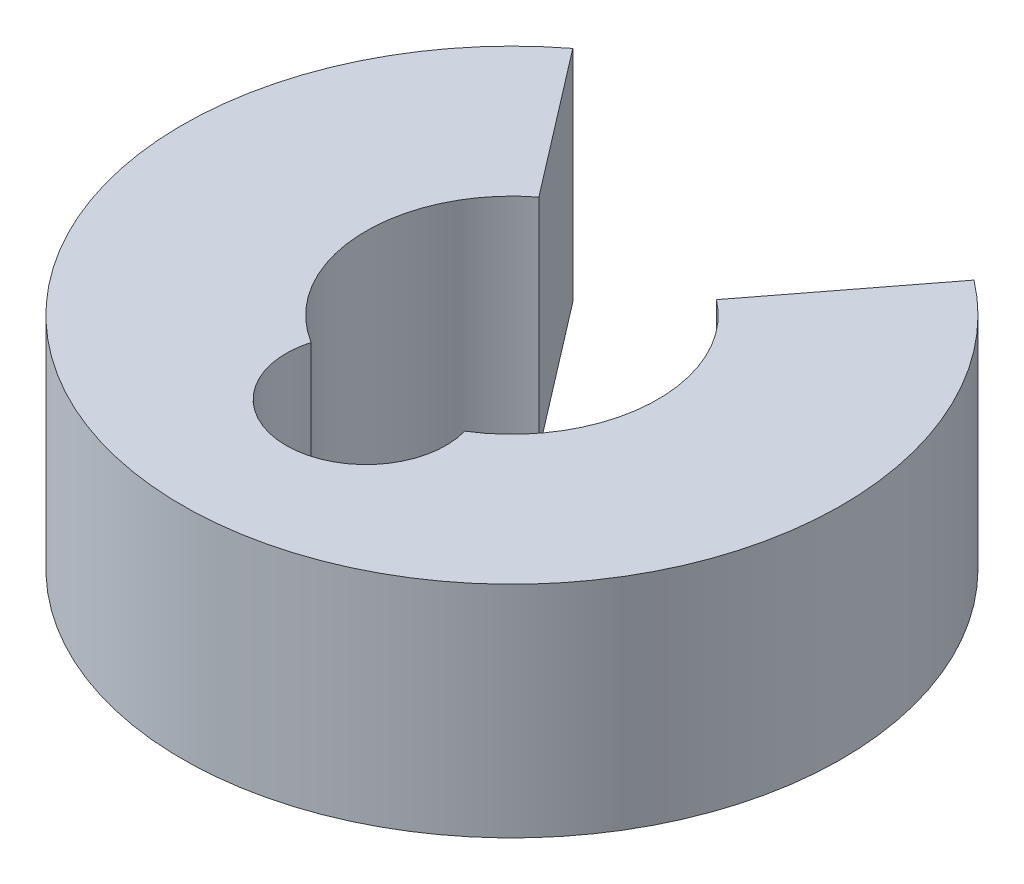
ISO-10303-21;
HEADER;
FILE_DESCRIPTION(('STEP AP214'),'2;1');
FILE_NAME('part.step','',(''),(''),'','','');
FILE_SCHEMA(('AUTOMOTIVE_DESIGN { 1 0 10303 214 1 1 1 1 }'));
ENDSEC;
DATA;
#1=APPLICATION_CONTEXT('core data for automotive mechanical design processes');
#2=APPLICATION_PROTOCOL_DEFINITION('international standard','automotive_design',2000,#1);
#3=PRODUCT_CONTEXT('',#1,'mechanical');
#4=PRODUCT('Part','Part','',(#3));
#5=PRODUCT_RELATED_PRODUCT_CATEGORY('part','',(#4));
#6=PRODUCT_DEFINITION_FORMATION('','',#4);
#7=PRODUCT_DEFINITION_CONTEXT('part definition',#1,'design');
#8=PRODUCT_DEFINITION('design','',#6,#7);
#9=PRODUCT_DEFINITION_SHAPE('','',#8);
#10=(LENGTH_UNIT() NAMED_UNIT(*) SI_UNIT(.MILLI.,.METRE.));
#11=(NAMED_UNIT(*) PLANE_ANGLE_UNIT() SI_UNIT($,.RADIAN.));
#12=(NAMED_UNIT(*) SI_UNIT($,.STERADIAN.) SOLID_ANGLE_UNIT());
#13=UNCERTAINTY_MEASURE_WITH_UNIT(LENGTH_MEASURE(1.E-05),#10,'distance_accuracy_value','');
#14=(GEOMETRIC_REPRESENTATION_CONTEXT(3) GLOBAL_UNCERTAINTY_ASSIGNED_CONTEXT((#13)) GLOBAL_UNIT_ASSIGNED_CONTEXT((#10,
#11,#12)) REPRESENTATION_CONTEXT('',''));
#15=CARTESIAN_POINT('',(0.,0.,0.));
#16=DIRECTION('',(0.,0.,1.));
#17=DIRECTION('',(1.,0.,0.));
#18=AXIS2_PLACEMENT_3D('',#15,#16,#17);
#19=CARTESIAN_POINT('',(0.,1.5875,2.1082));
#20=DIRECTION('',(0.,-1.,0.));
#21=DIRECTION('',(0.,0.,-1.));
#22=AXIS2_PLACEMENT_3D('',#19,#20,#21);
#23=CYLINDRICAL_SURFACE('',#22,1.1543);
#24=DIRECTION('',(0.,1.,0.));
#25=VECTOR('',#24,1.);
#26=CARTESIAN_POINT('',(-1.11020204436313,0.,1.7921938122569));
#27=LINE('',#26,#25);
#28=CARTESIAN_POINT('',(-1.11020204436313,-1.5875,1.7921938122569));
#29=VERTEX_POINT('',#28);
#30=CARTESIAN_POINT('',(-1.11020204436313,1.5875,1.7921938122569));
#31=VERTEX_POINT('',#30);
#32=EDGE_CURVE('E126',#29,#31,#27,.T.);
#33=ORIENTED_EDGE('',*,*,#32,.T.);
#34=CARTESIAN_POINT('',(0.,1.5875,2.1082));
#35=DIRECTION('',(0.,-1.,0.));
#36=DIRECTION('',(0.,0.,-1.));
#37=AXIS2_PLACEMENT_3D('',#34,#35,#36);
#38=CIRCLE('',#37,1.1543);
#39=CARTESIAN_POINT('',(1.11020204436313,1.5875,1.7921938122569));
#40=VERTEX_POINT('',#39);
#41=EDGE_CURVE('E119',#40,#31,#38,.T.);
#42=ORIENTED_EDGE('',*,*,#41,.F.);
#43=DIRECTION('',(0.,-1.,0.));
#44=VECTOR('',#43,1.);
#45=CARTESIAN_POINT('',(1.11020204436313,0.,1.7921938122569));
#46=LINE('',#45,#44);
#47=CARTESIAN_POINT('',(1.11020204436313,-1.5875,1.7921938122569));
#48=VERTEX_POINT('',#47);
#49=EDGE_CURVE('E27',#40,#48,#46,.T.);
#50=ORIENTED_EDGE('',*,*,#49,.T.);
#51=CARTESIAN_POINT('',(0.,-1.5875,2.1082));
#52=DIRECTION('',(0.,-1.,0.));
#53=DIRECTION('',(0.,0.,-1.));
#54=AXIS2_PLACEMENT_3D('',#51,#52,#53);
#55=CIRCLE('',#54,1.1543);
#56=EDGE_CURVE('E124',#48,#29,#55,.T.);
#57=ORIENTED_EDGE('',*,*,#56,.T.);
#58=EDGE_LOOP('',(#33,#42,#50,#57));
#59=FACE_BOUND('',#58,.T.);
#60=ADVANCED_FACE('F16',(#59),#23,.F.);
#61=CARTESIAN_POINT('',(0.,1.5875,0.));
#62=DIRECTION('',(-0.793353340291235,0.,0.608761429008721));
#63=DIRECTION('',(0.,1.,0.));
#64=AXIS2_PLACEMENT_3D('',#61,#62,#63);
#65=PLANE('',#64);
#66=DIRECTION('',(0.,-1.,0.));
#67=VECTOR('',#66,1.);
#68=CARTESIAN_POINT('',(-1.28339084463619,1.5875,-1.67254751200198));
#69=LINE('',#68,#67);
#70=CARTESIAN_POINT('',(-1.28339084463619,1.5875,-1.67254751200198));
#71=VERTEX_POINT('',#70);
#72=CARTESIAN_POINT('',(-1.28339084463619,-1.5875,-1.67254751200198));
#73=VERTEX_POINT('',#72);
#74=EDGE_CURVE('E138',#71,#73,#69,.T.);
#75=ORIENTED_EDGE('',*,*,#74,.T.);
#76=DIRECTION('',(-0.608761429008721,0.,-0.793353340291235));
#77=VECTOR('',#76,1.);
#78=CARTESIAN_POINT('',(0.,-1.5875,0.));
#79=LINE('',#78,#77);
#80=CARTESIAN_POINT('',(-2.89922630565404,-1.5875,-3.778345283137));
#81=VERTEX_POINT('',#80);
#82=EDGE_CURVE('E89',#73,#81,#79,.T.);
#83=ORIENTED_EDGE('',*,*,#82,.T.);
#84=DIRECTION('',(0.,-1.,0.));
#85=VECTOR('',#84,1.);
#86=CARTESIAN_POINT('',(-2.89922630565404,1.5875,-3.778345283137));
#87=LINE('',#86,#85);
#88=CARTESIAN_POINT('',(-2.89922630565404,1.5875,-3.778345283137));
#89=VERTEX_POINT('',#88);
#90=EDGE_CURVE('E41',#89,#81,#87,.T.);
#91=ORIENTED_EDGE('',*,*,#90,.F.);
#92=DIRECTION('',(-0.608761429008721,0.,-0.793353340291235));
#93=VECTOR('',#92,1.);
#94=CARTESIAN_POINT('',(0.,1.5875,0.));
#95=LINE('',#94,#93);
#96=EDGE_CURVE('E19',#71,#89,#95,.T.);
#97=ORIENTED_EDGE('',*,*,#96,.F.);
#98=EDGE_LOOP('',(#75,#83,#91,#97));
#99=FACE_BOUND('',#98,.T.);
#100=ADVANCED_FACE('F200',(#99),#65,.F.);
#101=CARTESIAN_POINT('',(0.,1.5875,0.));
#102=DIRECTION('',(-0.793353340291234,0.,-0.608761429008723));
#103=DIRECTION('',(-0.608761429008723,0.,0.793353340291234));
#104=AXIS2_PLACEMENT_3D('',#101,#102,#103);
#105=PLANE('',#104);
#106=DIRECTION('',(0.608761429008722,0.,-0.793353340291234));
#107=VECTOR('',#106,1.);
#108=CARTESIAN_POINT('',(0.,1.5875,0.));
#109=LINE('',#108,#107);
#110=CARTESIAN_POINT('',(1.28339084463619,1.5875,-1.67254751200198));
#111=VERTEX_POINT('',#110);
#112=CARTESIAN_POINT('',(2.89922630565404,1.5875,-3.778345283137));
#113=VERTEX_POINT('',#112);
#114=EDGE_CURVE('E122',#111,#113,#109,.T.);
#115=ORIENTED_EDGE('',*,*,#114,.T.);
#116=DIRECTION('',(0.,-1.,0.));
#117=VECTOR('',#116,1.);
#118=CARTESIAN_POINT('',(2.89922630565404,1.5875,-3.778345283137));
#119=LINE('',#118,#117);
#120=CARTESIAN_POINT('',(2.89922630565404,-1.5875,-3.778345283137));
#121=VERTEX_POINT('',#120);
#122=EDGE_CURVE('E68',#113,#121,#119,.T.);
#123=ORIENTED_EDGE('',*,*,#122,.T.);
#124=DIRECTION('',(0.608761429008722,0.,-0.793353340291234));
#125=VECTOR('',#124,1.);
#126=CARTESIAN_POINT('',(0.,-1.5875,0.));
#127=LINE('',#126,#125);
#128=CARTESIAN_POINT('',(1.28339084463619,-1.5875,-1.67254751200198));
#129=VERTEX_POINT('',#128);
#130=EDGE_CURVE('E150',#129,#121,#127,.T.);
#131=ORIENTED_EDGE('',*,*,#130,.F.);
#132=DIRECTION('',(0.,-1.,0.));
#133=VECTOR('',#132,1.);
#134=CARTESIAN_POINT('',(1.28339084463619,1.5875,-1.67254751200198));
#135=LINE('',#134,#133);
#136=EDGE_CURVE('E10',#111,#129,#135,.T.);
#137=ORIENTED_EDGE('',*,*,#136,.F.);
#138=EDGE_LOOP('',(#115,#123,#131,#137));
#139=FACE_BOUND('',#138,.T.);
#140=ADVANCED_FACE('F194',(#139),#105,.T.);
#141=CARTESIAN_POINT('',(0.,1.5875,0.));
#142=DIRECTION('',(0.,-1.,0.));
#143=DIRECTION('',(0.,0.,-1.));
#144=AXIS2_PLACEMENT_3D('',#141,#142,#143);
#145=CYLINDRICAL_SURFACE('',#144,2.1082);
#146=ORIENTED_EDGE('',*,*,#49,.F.);
#147=CARTESIAN_POINT('',(0.,1.5875,0.));
#148=DIRECTION('',(0.,1.,0.));
#149=DIRECTION('',(0.,0.,1.));
#150=AXIS2_PLACEMENT_3D('',#147,#148,#149);
#151=CIRCLE('',#150,2.1082);
#152=EDGE_CURVE('E107',#40,#111,#151,.T.);
#153=ORIENTED_EDGE('',*,*,#152,.T.);
#154=ORIENTED_EDGE('',*,*,#136,.T.);
#155=CARTESIAN_POINT('',(0.,-1.5875,0.));
#156=DIRECTION('',(0.,1.,0.));
#157=DIRECTION('',(0.,0.,1.));
#158=AXIS2_PLACEMENT_3D('',#155,#156,#157);
#159=CIRCLE('',#158,2.1082);
#160=EDGE_CURVE('E112',#48,#129,#159,.T.);
#161=ORIENTED_EDGE('',*,*,#160,.F.);
#162=EDGE_LOOP('',(#146,#153,#154,#161));
#163=FACE_BOUND('',#162,.T.);
#164=ADVANCED_FACE('F110',(#163),#145,.F.);
#165=CARTESIAN_POINT('',(0.,1.5875,0.));
#166=DIRECTION('',(0.,-1.,0.));
#167=DIRECTION('',(0.,0.,-1.));
#168=AXIS2_PLACEMENT_3D('',#165,#166,#167);
#169=CYLINDRICAL_SURFACE('',#168,4.7625);
#170=CARTESIAN_POINT('',(0.,1.5875,0.));
#171=DIRECTION('',(0.,1.,0.));
#172=DIRECTION('',(0.,0.,1.));
#173=AXIS2_PLACEMENT_3D('',#170,#171,#172);
#174=CIRCLE('',#173,4.7625);
#175=EDGE_CURVE('E136',#89,#113,#174,.T.);
#176=ORIENTED_EDGE('',*,*,#175,.F.);
#177=ORIENTED_EDGE('',*,*,#90,.T.);
#178=CARTESIAN_POINT('',(0.,-1.5875,0.));
#179=DIRECTION('',(0.,1.,0.));
#180=DIRECTION('',(0.,0.,1.));
#181=AXIS2_PLACEMENT_3D('',#178,#179,#180);
#182=CIRCLE('',#181,4.7625);
#183=EDGE_CURVE('E145',#81,#121,#182,.T.);
#184=ORIENTED_EDGE('',*,*,#183,.T.);
#185=ORIENTED_EDGE('',*,*,#122,.F.);
#186=EDGE_LOOP('',(#176,#177,#184,#185));
#187=FACE_BOUND('',#186,.T.);
#188=ADVANCED_FACE('F221',(#187),#169,.T.);
#189=CARTESIAN_POINT('',(0.,-1.5875,0.));
#190=DIRECTION('',(0.,1.,0.));
#191=DIRECTION('',(1.,0.,0.));
#192=AXIS2_PLACEMENT_3D('',#189,#190,#191);
#193=PLANE('',#192);
#194=CARTESIAN_POINT('',(0.,-1.5875,0.));
#195=DIRECTION('',(0.,1.,0.));
#196=DIRECTION('',(0.,0.,1.));
#197=AXIS2_PLACEMENT_3D('',#194,#195,#196);
#198=CIRCLE('',#197,2.1082);
#199=EDGE_CURVE('E165',#73,#29,#198,.T.);
#200=ORIENTED_EDGE('',*,*,#199,.T.);
#201=ORIENTED_EDGE('',*,*,#56,.F.);
#202=ORIENTED_EDGE('',*,*,#160,.T.);
#203=ORIENTED_EDGE('',*,*,#130,.T.);
#204=ORIENTED_EDGE('',*,*,#183,.F.);
#205=ORIENTED_EDGE('',*,*,#82,.F.);
#206=EDGE_LOOP('',(#200,#201,#202,#203,#204,#205));
#207=FACE_BOUND('',#206,.T.);
#208=ADVANCED_FACE('F219',(#207),#193,.F.);
#209=CARTESIAN_POINT('',(0.,1.5875,0.));
#210=DIRECTION('',(0.,1.,0.));
#211=DIRECTION('',(1.,0.,0.));
#212=AXIS2_PLACEMENT_3D('',#209,#210,#211);
#213=PLANE('',#212);
#214=ORIENTED_EDGE('',*,*,#41,.T.);
#215=CARTESIAN_POINT('',(0.,1.5875,0.));
#216=DIRECTION('',(0.,1.,0.));
#217=DIRECTION('',(0.,0.,1.));
#218=AXIS2_PLACEMENT_3D('',#215,#216,#217);
#219=CIRCLE('',#218,2.1082);
#220=EDGE_CURVE('E127',#71,#31,#219,.T.);
#221=ORIENTED_EDGE('',*,*,#220,.F.);
#222=ORIENTED_EDGE('',*,*,#96,.T.);
#223=ORIENTED_EDGE('',*,*,#175,.T.);
#224=ORIENTED_EDGE('',*,*,#114,.F.);
#225=ORIENTED_EDGE('',*,*,#152,.F.);
#226=EDGE_LOOP('',(#214,#221,#222,#223,#224,#225));
#227=FACE_BOUND('',#226,.T.);
#228=ADVANCED_FACE('F117',(#227),#213,.T.);
#229=CARTESIAN_POINT('',(0.,1.5875,0.));
#230=DIRECTION('',(0.,-1.,0.));
#231=DIRECTION('',(0.,0.,-1.));
#232=AXIS2_PLACEMENT_3D('',#229,#230,#231);
#233=CYLINDRICAL_SURFACE('',#232,2.1082);
#234=ORIENTED_EDGE('',*,*,#32,.F.);
#235=ORIENTED_EDGE('',*,*,#199,.F.);
#236=ORIENTED_EDGE('',*,*,#74,.F.);
#237=ORIENTED_EDGE('',*,*,#220,.T.);
#238=EDGE_LOOP('',(#234,#235,#236,#237));
#239=FACE_BOUND('',#238,.T.);
#240=ADVANCED_FACE('F204',(#239),#233,.F.);
#241=CLOSED_SHELL('',(#60,#100,#140,#164,#188,#208,#228,#240));
#242=MANIFOLD_SOLID_BREP('B1',#241);
#243=ADVANCED_BREP_SHAPE_REPRESENTATION('',(#18,#242),#14);
#244=SHAPE_DEFINITION_REPRESENTATION(#9,#243);
ENDSEC;
END-ISO-10303-21;
